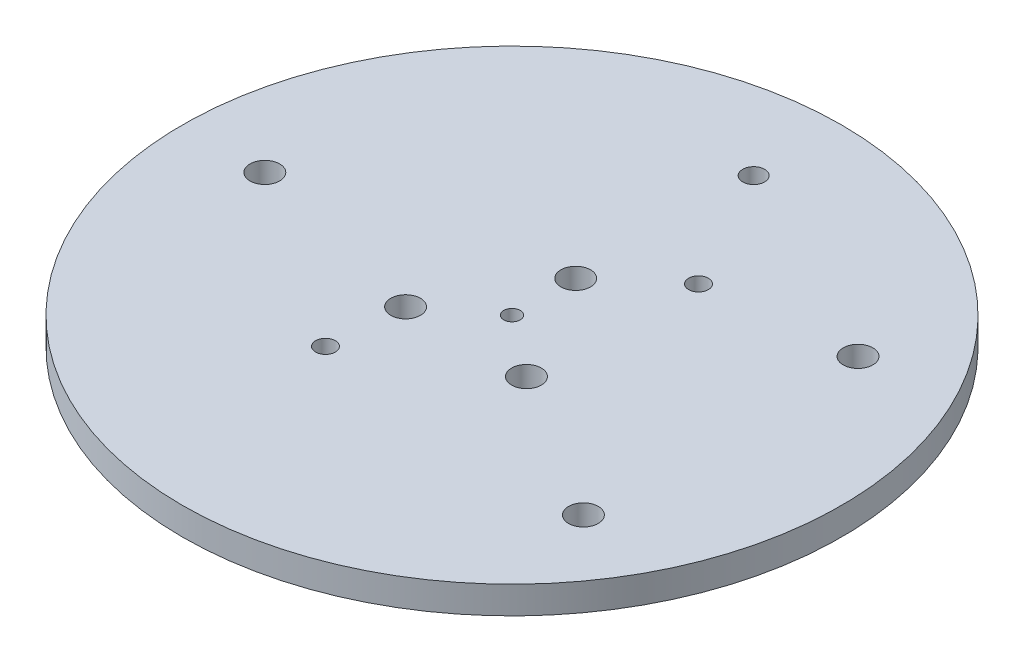
ISO-10303-21;
HEADER;
FILE_DESCRIPTION(('STEP AP214'),'2;1');
FILE_NAME('part.step','',(''),(''),'','','');
FILE_SCHEMA(('AUTOMOTIVE_DESIGN { 1 0 10303 214 1 1 1 1 }'));
ENDSEC;
DATA;
#1=APPLICATION_CONTEXT('core data for automotive mechanical design processes');
#2=APPLICATION_PROTOCOL_DEFINITION('international standard','automotive_design',2000,#1);
#3=PRODUCT_CONTEXT('',#1,'mechanical');
#4=PRODUCT('Part','Part','',(#3));
#5=PRODUCT_RELATED_PRODUCT_CATEGORY('part','',(#4));
#6=PRODUCT_DEFINITION_FORMATION('','',#4);
#7=PRODUCT_DEFINITION_CONTEXT('part definition',#1,'design');
#8=PRODUCT_DEFINITION('design','',#6,#7);
#9=PRODUCT_DEFINITION_SHAPE('','',#8);
#10=(LENGTH_UNIT() NAMED_UNIT(*) SI_UNIT(.MILLI.,.METRE.));
#11=(NAMED_UNIT(*) PLANE_ANGLE_UNIT() SI_UNIT($,.RADIAN.));
#12=(NAMED_UNIT(*) SI_UNIT($,.STERADIAN.) SOLID_ANGLE_UNIT());
#13=UNCERTAINTY_MEASURE_WITH_UNIT(LENGTH_MEASURE(1.E-05),#10,'distance_accuracy_value','');
#14=(GEOMETRIC_REPRESENTATION_CONTEXT(3) GLOBAL_UNCERTAINTY_ASSIGNED_CONTEXT((#13)) GLOBAL_UNIT_ASSIGNED_CONTEXT((#10,
#11,#12)) REPRESENTATION_CONTEXT('',''));
#15=CARTESIAN_POINT('',(0.,0.,0.));
#16=DIRECTION('',(0.,0.,1.));
#17=DIRECTION('',(1.,0.,0.));
#18=AXIS2_PLACEMENT_3D('',#15,#16,#17);
#19=CARTESIAN_POINT('',(0.,6.35,0.));
#20=DIRECTION('',(0.,-1.,0.));
#21=DIRECTION('',(0.,0.,-1.));
#22=AXIS2_PLACEMENT_3D('',#19,#20,#21);
#23=CYLINDRICAL_SURFACE('',#22,76.2);
#24=CARTESIAN_POINT('',(0.,6.35,0.));
#25=DIRECTION('',(0.,1.,0.));
#26=DIRECTION('',(0.,0.,1.));
#27=AXIS2_PLACEMENT_3D('',#24,#25,#26);
#28=CIRCLE('',#27,76.2);
#29=CARTESIAN_POINT('',(0.,6.35,76.2));
#30=VERTEX_POINT('',#29);
#31=EDGE_CURVE('E10',#30,#30,#28,.T.);
#32=ORIENTED_EDGE('',*,*,#31,.F.);
#33=EDGE_LOOP('',(#32));
#34=FACE_BOUND('',#33,.T.);
#35=CARTESIAN_POINT('',(0.,0.,0.));
#36=DIRECTION('',(0.,1.,0.));
#37=DIRECTION('',(0.,0.,1.));
#38=AXIS2_PLACEMENT_3D('',#35,#36,#37);
#39=CIRCLE('',#38,76.2);
#40=CARTESIAN_POINT('',(0.,0.,76.2));
#41=VERTEX_POINT('',#40);
#42=EDGE_CURVE('E36',#41,#41,#39,.T.);
#43=ORIENTED_EDGE('',*,*,#42,.T.);
#44=EDGE_LOOP('',(#43));
#45=FACE_BOUND('',#44,.T.);
#46=ADVANCED_FACE('F33',(#34,#45),#23,.T.);
#47=CARTESIAN_POINT('',(0.,6.35,0.));
#48=DIRECTION('',(0.,1.,0.));
#49=DIRECTION('',(0.,0.,1.));
#50=AXIS2_PLACEMENT_3D('',#47,#48,#49);
#51=PLANE('',#50);
#52=CARTESIAN_POINT('',(15.310260997638,6.35,-27.8147156768536));
#53=DIRECTION('',(0.,1.,0.));
#54=DIRECTION('',(0.,0.,1.));
#55=AXIS2_PLACEMENT_3D('',#52,#53,#54);
#56=CIRCLE('',#55,2.286);
#57=CARTESIAN_POINT('',(15.310260997638,6.35,-25.5287156768536));
#58=VERTEX_POINT('',#57);
#59=EDGE_CURVE('E99',#58,#58,#56,.T.);
#60=ORIENTED_EDGE('',*,*,#59,.F.);
#61=EDGE_LOOP('',(#60));
#62=FACE_BOUND('',#61,.T.);
#63=CARTESIAN_POINT('',(-15.310260997638,6.35,27.8147156768536));
#64=DIRECTION('',(0.,1.,0.));
#65=DIRECTION('',(0.,0.,1.));
#66=AXIS2_PLACEMENT_3D('',#63,#64,#65);
#67=CIRCLE('',#66,2.286);
#68=CARTESIAN_POINT('',(-15.310260997638,6.35,30.1007156768536));
#69=VERTEX_POINT('',#68);
#70=EDGE_CURVE('E93',#69,#69,#67,.T.);
#71=ORIENTED_EDGE('',*,*,#70,.F.);
#72=EDGE_LOOP('',(#71));
#73=FACE_BOUND('',#72,.T.);
#74=CARTESIAN_POINT('',(0.,6.35,-55.88));
#75=DIRECTION('',(0.,1.,0.));
#76=DIRECTION('',(0.,0.,1.));
#77=AXIS2_PLACEMENT_3D('',#74,#75,#76);
#78=CIRCLE('',#77,2.54);
#79=CARTESIAN_POINT('',(0.,6.35,-53.34));
#80=VERTEX_POINT('',#79);
#81=EDGE_CURVE('E87',#80,#80,#78,.T.);
#82=ORIENTED_EDGE('',*,*,#81,.F.);
#83=EDGE_LOOP('',(#82));
#84=FACE_BOUND('',#83,.T.);
#85=CARTESIAN_POINT('',(48.26,6.35,31.75));
#86=DIRECTION('',(0.,1.,0.));
#87=DIRECTION('',(0.,0.,1.));
#88=AXIS2_PLACEMENT_3D('',#85,#86,#87);
#89=CIRCLE('',#88,3.429);
#90=CARTESIAN_POINT('',(48.26,6.35,35.179));
#91=VERTEX_POINT('',#90);
#92=EDGE_CURVE('E81',#91,#91,#89,.T.);
#93=ORIENTED_EDGE('',*,*,#92,.F.);
#94=EDGE_LOOP('',(#93));
#95=FACE_BOUND('',#94,.T.);
#96=CARTESIAN_POINT('',(48.26,6.35,-31.75));
#97=DIRECTION('',(0.,1.,0.));
#98=DIRECTION('',(0.,0.,1.));
#99=AXIS2_PLACEMENT_3D('',#96,#97,#98);
#100=CIRCLE('',#99,3.429);
#101=CARTESIAN_POINT('',(48.26,6.35,-28.321));
#102=VERTEX_POINT('',#101);
#103=EDGE_CURVE('E75',#102,#102,#100,.T.);
#104=ORIENTED_EDGE('',*,*,#103,.F.);
#105=EDGE_LOOP('',(#104));
#106=FACE_BOUND('',#105,.T.);
#107=CARTESIAN_POINT('',(-57.15,6.35,0.));
#108=DIRECTION('',(0.,1.,0.));
#109=DIRECTION('',(0.,0.,1.));
#110=AXIS2_PLACEMENT_3D('',#107,#108,#109);
#111=CIRCLE('',#110,3.429);
#112=CARTESIAN_POINT('',(-57.15,6.35,3.429));
#113=VERTEX_POINT('',#112);
#114=EDGE_CURVE('E69',#113,#113,#111,.T.);
#115=ORIENTED_EDGE('',*,*,#114,.F.);
#116=EDGE_LOOP('',(#115));
#117=FACE_BOUND('',#116,.T.);
#118=CARTESIAN_POINT('',(13.97,6.35,10.6311432594621));
#119=DIRECTION('',(0.,1.,0.));
#120=DIRECTION('',(0.,0.,1.));
#121=AXIS2_PLACEMENT_3D('',#118,#119,#120);
#122=CIRCLE('',#121,3.429);
#123=CARTESIAN_POINT('',(13.97,6.35,14.0601432594621));
#124=VERTEX_POINT('',#123);
#125=EDGE_CURVE('E63',#124,#124,#122,.T.);
#126=ORIENTED_EDGE('',*,*,#125,.F.);
#127=EDGE_LOOP('',(#126));
#128=FACE_BOUND('',#127,.T.);
#129=CARTESIAN_POINT('',(-13.97,6.35,10.6311432594621));
#130=DIRECTION('',(0.,1.,0.));
#131=DIRECTION('',(0.,0.,1.));
#132=AXIS2_PLACEMENT_3D('',#129,#130,#131);
#133=CIRCLE('',#132,3.429);
#134=CARTESIAN_POINT('',(-13.97,6.35,14.0601432594621));
#135=VERTEX_POINT('',#134);
#136=EDGE_CURVE('E57',#135,#135,#133,.T.);
#137=ORIENTED_EDGE('',*,*,#136,.F.);
#138=EDGE_LOOP('',(#137));
#139=FACE_BOUND('',#138,.T.);
#140=CARTESIAN_POINT('',(0.,6.35,-14.732));
#141=DIRECTION('',(0.,1.,0.));
#142=DIRECTION('',(0.,0.,1.));
#143=AXIS2_PLACEMENT_3D('',#140,#141,#142);
#144=CIRCLE('',#143,3.429);
#145=CARTESIAN_POINT('',(0.,6.35,-11.303));
#146=VERTEX_POINT('',#145);
#147=EDGE_CURVE('E51',#146,#146,#144,.T.);
#148=ORIENTED_EDGE('',*,*,#147,.F.);
#149=EDGE_LOOP('',(#148));
#150=FACE_BOUND('',#149,.T.);
#151=CARTESIAN_POINT('',(0.,6.35,0.));
#152=DIRECTION('',(0.,1.,0.));
#153=DIRECTION('',(0.,0.,1.));
#154=AXIS2_PLACEMENT_3D('',#151,#152,#153);
#155=CIRCLE('',#154,1.905);
#156=CARTESIAN_POINT('',(0.,6.35,1.905));
#157=VERTEX_POINT('',#156);
#158=EDGE_CURVE('E45',#157,#157,#155,.T.);
#159=ORIENTED_EDGE('',*,*,#158,.F.);
#160=EDGE_LOOP('',(#159));
#161=FACE_BOUND('',#160,.T.);
#162=ORIENTED_EDGE('',*,*,#31,.T.);
#163=EDGE_LOOP('',(#162));
#164=FACE_BOUND('',#163,.T.);
#165=ADVANCED_FACE('F115',(#62,#73,#84,#95,#106,#117,#128,#139,#150,#161,#164),#51,.T.);
#166=CARTESIAN_POINT('',(0.,0.,0.));
#167=DIRECTION('',(0.,1.,0.));
#168=DIRECTION('',(0.,0.,1.));
#169=AXIS2_PLACEMENT_3D('',#166,#167,#168);
#170=PLANE('',#169);
#171=CARTESIAN_POINT('',(15.310260997638,0.,-27.8147156768536));
#172=DIRECTION('',(0.,1.,0.));
#173=DIRECTION('',(0.,0.,1.));
#174=AXIS2_PLACEMENT_3D('',#171,#172,#173);
#175=CIRCLE('',#174,2.286);
#176=CARTESIAN_POINT('',(15.310260997638,0.,-25.5287156768536));
#177=VERTEX_POINT('',#176);
#178=EDGE_CURVE('E96',#177,#177,#175,.T.);
#179=ORIENTED_EDGE('',*,*,#178,.T.);
#180=EDGE_LOOP('',(#179));
#181=FACE_BOUND('',#180,.T.);
#182=CARTESIAN_POINT('',(-15.310260997638,0.,27.8147156768536));
#183=DIRECTION('',(0.,1.,0.));
#184=DIRECTION('',(0.,0.,1.));
#185=AXIS2_PLACEMENT_3D('',#182,#183,#184);
#186=CIRCLE('',#185,2.286);
#187=CARTESIAN_POINT('',(-15.310260997638,0.,30.1007156768536));
#188=VERTEX_POINT('',#187);
#189=EDGE_CURVE('E90',#188,#188,#186,.T.);
#190=ORIENTED_EDGE('',*,*,#189,.T.);
#191=EDGE_LOOP('',(#190));
#192=FACE_BOUND('',#191,.T.);
#193=CARTESIAN_POINT('',(0.,0.,-55.88));
#194=DIRECTION('',(0.,1.,0.));
#195=DIRECTION('',(0.,0.,1.));
#196=AXIS2_PLACEMENT_3D('',#193,#194,#195);
#197=CIRCLE('',#196,2.54);
#198=CARTESIAN_POINT('',(0.,0.,-53.34));
#199=VERTEX_POINT('',#198);
#200=EDGE_CURVE('E84',#199,#199,#197,.T.);
#201=ORIENTED_EDGE('',*,*,#200,.T.);
#202=EDGE_LOOP('',(#201));
#203=FACE_BOUND('',#202,.T.);
#204=CARTESIAN_POINT('',(48.26,0.,31.75));
#205=DIRECTION('',(0.,1.,0.));
#206=DIRECTION('',(0.,0.,1.));
#207=AXIS2_PLACEMENT_3D('',#204,#205,#206);
#208=CIRCLE('',#207,3.429);
#209=CARTESIAN_POINT('',(48.26,0.,35.179));
#210=VERTEX_POINT('',#209);
#211=EDGE_CURVE('E78',#210,#210,#208,.T.);
#212=ORIENTED_EDGE('',*,*,#211,.T.);
#213=EDGE_LOOP('',(#212));
#214=FACE_BOUND('',#213,.T.);
#215=CARTESIAN_POINT('',(48.26,0.,-31.75));
#216=DIRECTION('',(0.,1.,0.));
#217=DIRECTION('',(0.,0.,1.));
#218=AXIS2_PLACEMENT_3D('',#215,#216,#217);
#219=CIRCLE('',#218,3.429);
#220=CARTESIAN_POINT('',(48.26,0.,-28.321));
#221=VERTEX_POINT('',#220);
#222=EDGE_CURVE('E72',#221,#221,#219,.T.);
#223=ORIENTED_EDGE('',*,*,#222,.T.);
#224=EDGE_LOOP('',(#223));
#225=FACE_BOUND('',#224,.T.);
#226=CARTESIAN_POINT('',(-57.15,0.,0.));
#227=DIRECTION('',(0.,1.,0.));
#228=DIRECTION('',(0.,0.,1.));
#229=AXIS2_PLACEMENT_3D('',#226,#227,#228);
#230=CIRCLE('',#229,3.429);
#231=CARTESIAN_POINT('',(-57.15,0.,3.429));
#232=VERTEX_POINT('',#231);
#233=EDGE_CURVE('E66',#232,#232,#230,.T.);
#234=ORIENTED_EDGE('',*,*,#233,.T.);
#235=EDGE_LOOP('',(#234));
#236=FACE_BOUND('',#235,.T.);
#237=CARTESIAN_POINT('',(13.97,0.,10.6311432594621));
#238=DIRECTION('',(0.,1.,0.));
#239=DIRECTION('',(0.,0.,1.));
#240=AXIS2_PLACEMENT_3D('',#237,#238,#239);
#241=CIRCLE('',#240,3.429);
#242=CARTESIAN_POINT('',(13.97,0.,14.0601432594621));
#243=VERTEX_POINT('',#242);
#244=EDGE_CURVE('E60',#243,#243,#241,.T.);
#245=ORIENTED_EDGE('',*,*,#244,.T.);
#246=EDGE_LOOP('',(#245));
#247=FACE_BOUND('',#246,.T.);
#248=CARTESIAN_POINT('',(-13.97,0.,10.6311432594621));
#249=DIRECTION('',(0.,1.,0.));
#250=DIRECTION('',(0.,0.,1.));
#251=AXIS2_PLACEMENT_3D('',#248,#249,#250);
#252=CIRCLE('',#251,3.429);
#253=CARTESIAN_POINT('',(-13.97,0.,14.0601432594621));
#254=VERTEX_POINT('',#253);
#255=EDGE_CURVE('E54',#254,#254,#252,.T.);
#256=ORIENTED_EDGE('',*,*,#255,.T.);
#257=EDGE_LOOP('',(#256));
#258=FACE_BOUND('',#257,.T.);
#259=CARTESIAN_POINT('',(0.,0.,-14.732));
#260=DIRECTION('',(0.,1.,0.));
#261=DIRECTION('',(0.,0.,1.));
#262=AXIS2_PLACEMENT_3D('',#259,#260,#261);
#263=CIRCLE('',#262,3.429);
#264=CARTESIAN_POINT('',(0.,0.,-11.303));
#265=VERTEX_POINT('',#264);
#266=EDGE_CURVE('E48',#265,#265,#263,.T.);
#267=ORIENTED_EDGE('',*,*,#266,.T.);
#268=EDGE_LOOP('',(#267));
#269=FACE_BOUND('',#268,.T.);
#270=CARTESIAN_POINT('',(0.,0.,0.));
#271=DIRECTION('',(0.,1.,0.));
#272=DIRECTION('',(0.,0.,1.));
#273=AXIS2_PLACEMENT_3D('',#270,#271,#272);
#274=CIRCLE('',#273,1.905);
#275=CARTESIAN_POINT('',(0.,0.,1.905));
#276=VERTEX_POINT('',#275);
#277=EDGE_CURVE('E43',#276,#276,#274,.T.);
#278=ORIENTED_EDGE('',*,*,#277,.T.);
#279=EDGE_LOOP('',(#278));
#280=FACE_BOUND('',#279,.T.);
#281=ORIENTED_EDGE('',*,*,#42,.F.);
#282=EDGE_LOOP('',(#281));
#283=FACE_BOUND('',#282,.T.);
#284=ADVANCED_FACE('F105',(#181,#192,#203,#214,#225,#236,#247,#258,#269,#280,#283),#170,.F.);
#285=CARTESIAN_POINT('',(0.,0.,0.));
#286=DIRECTION('',(0.,1.,0.));
#287=DIRECTION('',(0.,0.,1.));
#288=AXIS2_PLACEMENT_3D('',#285,#286,#287);
#289=CYLINDRICAL_SURFACE('',#288,1.905);
#290=ORIENTED_EDGE('',*,*,#277,.F.);
#291=EDGE_LOOP('',(#290));
#292=FACE_BOUND('',#291,.T.);
#293=ORIENTED_EDGE('',*,*,#158,.T.);
#294=EDGE_LOOP('',(#293));
#295=FACE_BOUND('',#294,.T.);
#296=ADVANCED_FACE('F137',(#292,#295),#289,.F.);
#297=CARTESIAN_POINT('',(0.,0.,-14.732));
#298=DIRECTION('',(0.,1.,0.));
#299=DIRECTION('',(0.,0.,1.));
#300=AXIS2_PLACEMENT_3D('',#297,#298,#299);
#301=CYLINDRICAL_SURFACE('',#300,3.429);
#302=ORIENTED_EDGE('',*,*,#266,.F.);
#303=EDGE_LOOP('',(#302));
#304=FACE_BOUND('',#303,.T.);
#305=ORIENTED_EDGE('',*,*,#147,.T.);
#306=EDGE_LOOP('',(#305));
#307=FACE_BOUND('',#306,.T.);
#308=ADVANCED_FACE('F139',(#304,#307),#301,.F.);
#309=CARTESIAN_POINT('',(-13.97,0.,10.6311432594621));
#310=DIRECTION('',(0.,1.,0.));
#311=DIRECTION('',(0.,0.,1.));
#312=AXIS2_PLACEMENT_3D('',#309,#310,#311);
#313=CYLINDRICAL_SURFACE('',#312,3.429);
#314=ORIENTED_EDGE('',*,*,#255,.F.);
#315=EDGE_LOOP('',(#314));
#316=FACE_BOUND('',#315,.T.);
#317=ORIENTED_EDGE('',*,*,#136,.T.);
#318=EDGE_LOOP('',(#317));
#319=FACE_BOUND('',#318,.T.);
#320=ADVANCED_FACE('F146',(#316,#319),#313,.F.);
#321=CARTESIAN_POINT('',(13.97,0.,10.6311432594621));
#322=DIRECTION('',(0.,1.,0.));
#323=DIRECTION('',(0.,0.,1.));
#324=AXIS2_PLACEMENT_3D('',#321,#322,#323);
#325=CYLINDRICAL_SURFACE('',#324,3.429);
#326=ORIENTED_EDGE('',*,*,#244,.F.);
#327=EDGE_LOOP('',(#326));
#328=FACE_BOUND('',#327,.T.);
#329=ORIENTED_EDGE('',*,*,#125,.T.);
#330=EDGE_LOOP('',(#329));
#331=FACE_BOUND('',#330,.T.);
#332=ADVANCED_FACE('F214',(#328,#331),#325,.F.);
#333=CARTESIAN_POINT('',(-57.15,0.,0.));
#334=DIRECTION('',(0.,1.,0.));
#335=DIRECTION('',(0.,0.,1.));
#336=AXIS2_PLACEMENT_3D('',#333,#334,#335);
#337=CYLINDRICAL_SURFACE('',#336,3.429);
#338=ORIENTED_EDGE('',*,*,#233,.F.);
#339=EDGE_LOOP('',(#338));
#340=FACE_BOUND('',#339,.T.);
#341=ORIENTED_EDGE('',*,*,#114,.T.);
#342=EDGE_LOOP('',(#341));
#343=FACE_BOUND('',#342,.T.);
#344=ADVANCED_FACE('F206',(#340,#343),#337,.F.);
#345=CARTESIAN_POINT('',(48.26,0.,-31.75));
#346=DIRECTION('',(0.,1.,0.));
#347=DIRECTION('',(0.,0.,1.));
#348=AXIS2_PLACEMENT_3D('',#345,#346,#347);
#349=CYLINDRICAL_SURFACE('',#348,3.429);
#350=ORIENTED_EDGE('',*,*,#222,.F.);
#351=EDGE_LOOP('',(#350));
#352=FACE_BOUND('',#351,.T.);
#353=ORIENTED_EDGE('',*,*,#103,.T.);
#354=EDGE_LOOP('',(#353));
#355=FACE_BOUND('',#354,.T.);
#356=ADVANCED_FACE('F198',(#352,#355),#349,.F.);
#357=CARTESIAN_POINT('',(48.26,0.,31.75));
#358=DIRECTION('',(0.,1.,0.));
#359=DIRECTION('',(0.,0.,1.));
#360=AXIS2_PLACEMENT_3D('',#357,#358,#359);
#361=CYLINDRICAL_SURFACE('',#360,3.429);
#362=ORIENTED_EDGE('',*,*,#211,.F.);
#363=EDGE_LOOP('',(#362));
#364=FACE_BOUND('',#363,.T.);
#365=ORIENTED_EDGE('',*,*,#92,.T.);
#366=EDGE_LOOP('',(#365));
#367=FACE_BOUND('',#366,.T.);
#368=ADVANCED_FACE('F191',(#364,#367),#361,.F.);
#369=CARTESIAN_POINT('',(0.,0.,-55.88));
#370=DIRECTION('',(0.,1.,0.));
#371=DIRECTION('',(0.,0.,1.));
#372=AXIS2_PLACEMENT_3D('',#369,#370,#371);
#373=CYLINDRICAL_SURFACE('',#372,2.54);
#374=ORIENTED_EDGE('',*,*,#200,.F.);
#375=EDGE_LOOP('',(#374));
#376=FACE_BOUND('',#375,.T.);
#377=ORIENTED_EDGE('',*,*,#81,.T.);
#378=EDGE_LOOP('',(#377));
#379=FACE_BOUND('',#378,.T.);
#380=ADVANCED_FACE('F176',(#376,#379),#373,.F.);
#381=CARTESIAN_POINT('',(-15.310260997638,0.,27.8147156768536));
#382=DIRECTION('',(0.,1.,0.));
#383=DIRECTION('',(0.,0.,1.));
#384=AXIS2_PLACEMENT_3D('',#381,#382,#383);
#385=CYLINDRICAL_SURFACE('',#384,2.286);
#386=ORIENTED_EDGE('',*,*,#189,.F.);
#387=EDGE_LOOP('',(#386));
#388=FACE_BOUND('',#387,.T.);
#389=ORIENTED_EDGE('',*,*,#70,.T.);
#390=EDGE_LOOP('',(#389));
#391=FACE_BOUND('',#390,.T.);
#392=ADVANCED_FACE('F111',(#388,#391),#385,.F.);
#393=CARTESIAN_POINT('',(15.310260997638,0.,-27.8147156768536));
#394=DIRECTION('',(0.,1.,0.));
#395=DIRECTION('',(0.,0.,1.));
#396=AXIS2_PLACEMENT_3D('',#393,#394,#395);
#397=CYLINDRICAL_SURFACE('',#396,2.286);
#398=ORIENTED_EDGE('',*,*,#178,.F.);
#399=EDGE_LOOP('',(#398));
#400=FACE_BOUND('',#399,.T.);
#401=ORIENTED_EDGE('',*,*,#59,.T.);
#402=EDGE_LOOP('',(#401));
#403=FACE_BOUND('',#402,.T.);
#404=ADVANCED_FACE('F108',(#400,#403),#397,.F.);
#405=CLOSED_SHELL('',(#46,#165,#284,#296,#308,#320,#332,#344,#356,#368,#380,#392,#404));
#406=MANIFOLD_SOLID_BREP('B2',#405);
#407=ADVANCED_BREP_SHAPE_REPRESENTATION('',(#18,#406),#14);
#408=SHAPE_DEFINITION_REPRESENTATION(#9,#407);
ENDSEC;
END-ISO-10303-21;
